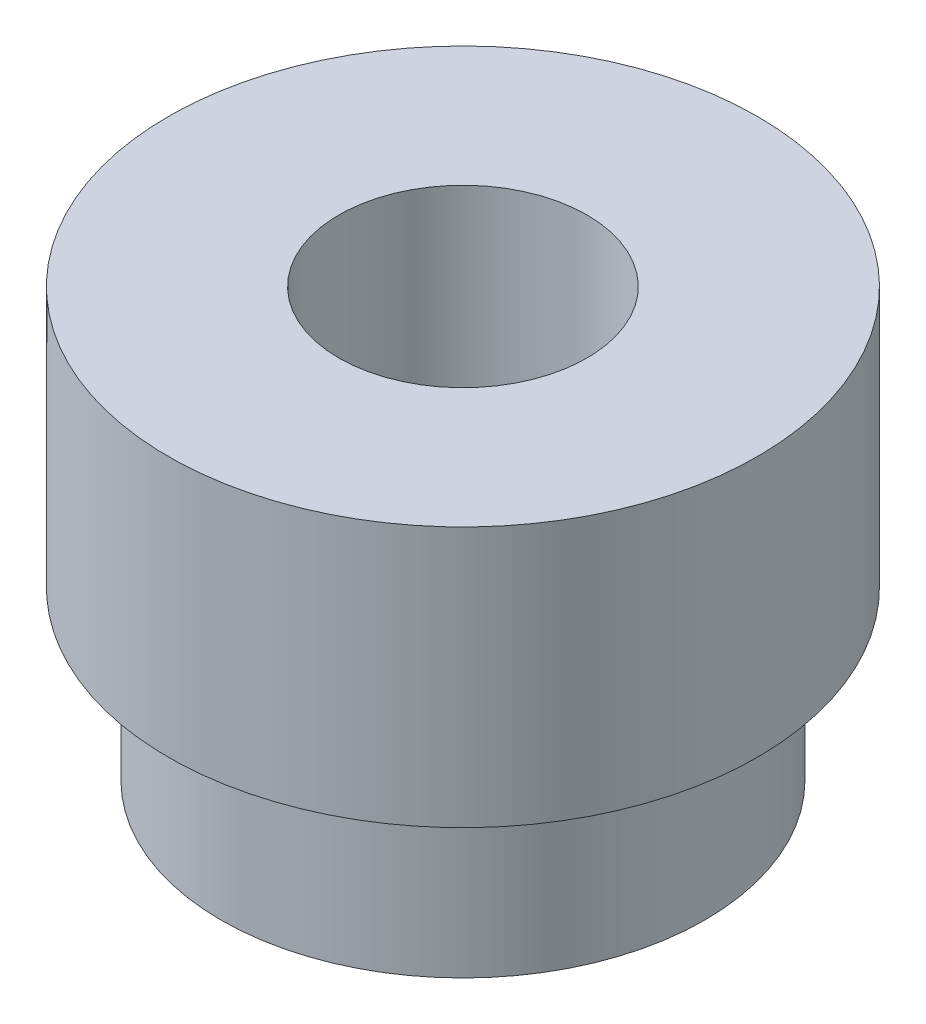
ISO-10303-21;
HEADER;
FILE_DESCRIPTION(('STEP AP214'),'2;1');
FILE_NAME('part.step','',(''),(''),'','','');
FILE_SCHEMA(('AUTOMOTIVE_DESIGN { 1 0 10303 214 1 1 1 1 }'));
ENDSEC;
DATA;
#1=APPLICATION_CONTEXT('core data for automotive mechanical design processes');
#2=APPLICATION_PROTOCOL_DEFINITION('international standard','automotive_design',2000,#1);
#3=PRODUCT_CONTEXT('',#1,'mechanical');
#4=PRODUCT('Part','Part','',(#3));
#5=PRODUCT_RELATED_PRODUCT_CATEGORY('part','',(#4));
#6=PRODUCT_DEFINITION_FORMATION('','',#4);
#7=PRODUCT_DEFINITION_CONTEXT('part definition',#1,'design');
#8=PRODUCT_DEFINITION('design','',#6,#7);
#9=PRODUCT_DEFINITION_SHAPE('','',#8);
#10=(LENGTH_UNIT() NAMED_UNIT(*) SI_UNIT(.MILLI.,.METRE.));
#11=(NAMED_UNIT(*) PLANE_ANGLE_UNIT() SI_UNIT($,.RADIAN.));
#12=(NAMED_UNIT(*) SI_UNIT($,.STERADIAN.) SOLID_ANGLE_UNIT());
#13=UNCERTAINTY_MEASURE_WITH_UNIT(LENGTH_MEASURE(1.E-05),#10,'distance_accuracy_value','');
#14=(GEOMETRIC_REPRESENTATION_CONTEXT(3) GLOBAL_UNCERTAINTY_ASSIGNED_CONTEXT((#13)) GLOBAL_UNIT_ASSIGNED_CONTEXT((#10,
#11,#12)) REPRESENTATION_CONTEXT('',''));
#15=CARTESIAN_POINT('',(0.,0.,0.));
#16=DIRECTION('',(0.,0.,1.));
#17=DIRECTION('',(1.,0.,0.));
#18=AXIS2_PLACEMENT_3D('',#15,#16,#17);
#19=CARTESIAN_POINT('',(0.,0.,0.));
#20=DIRECTION('',(0.,-1.,0.));
#21=DIRECTION('',(0.,0.,-1.));
#22=AXIS2_PLACEMENT_3D('',#19,#20,#21);
#23=CYLINDRICAL_SURFACE('',#22,1.);
#24=CARTESIAN_POINT('',(0.,3.45,0.));
#25=DIRECTION('',(0.,-1.,0.));
#26=DIRECTION('',(0.,0.,-1.));
#27=AXIS2_PLACEMENT_3D('',#24,#25,#26);
#28=CIRCLE('',#27,1.);
#29=CARTESIAN_POINT('',(0.,3.45,-1.));
#30=VERTEX_POINT('',#29);
#31=EDGE_CURVE('E10',#30,#30,#28,.T.);
#32=ORIENTED_EDGE('',*,*,#31,.F.);
#33=EDGE_LOOP('',(#32));
#34=FACE_BOUND('',#33,.T.);
#35=CARTESIAN_POINT('',(0.,0.,0.));
#36=DIRECTION('',(0.,-1.,0.));
#37=DIRECTION('',(0.,0.,-1.));
#38=AXIS2_PLACEMENT_3D('',#35,#36,#37);
#39=CIRCLE('',#38,1.);
#40=CARTESIAN_POINT('',(0.,0.,-1.));
#41=VERTEX_POINT('',#40);
#42=EDGE_CURVE('E63',#41,#41,#39,.T.);
#43=ORIENTED_EDGE('',*,*,#42,.T.);
#44=EDGE_LOOP('',(#43));
#45=FACE_BOUND('',#44,.T.);
#46=ADVANCED_FACE('F36',(#34,#45),#23,.F.);
#47=CARTESIAN_POINT('',(-1.,3.45,0.));
#48=DIRECTION('',(0.,-1.,0.));
#49=DIRECTION('',(0.,0.,-1.));
#50=AXIS2_PLACEMENT_3D('',#47,#48,#49);
#51=PLANE('',#50);
#52=CARTESIAN_POINT('',(0.,3.45,0.));
#53=DIRECTION('',(0.,-1.,0.));
#54=DIRECTION('',(0.,0.,-1.));
#55=AXIS2_PLACEMENT_3D('',#52,#53,#54);
#56=CIRCLE('',#55,2.375);
#57=CARTESIAN_POINT('',(0.,3.45,-2.375));
#58=VERTEX_POINT('',#57);
#59=EDGE_CURVE('E43',#58,#58,#56,.T.);
#60=ORIENTED_EDGE('',*,*,#59,.F.);
#61=EDGE_LOOP('',(#60));
#62=FACE_BOUND('',#61,.T.);
#63=ORIENTED_EDGE('',*,*,#31,.T.);
#64=EDGE_LOOP('',(#63));
#65=FACE_BOUND('',#64,.T.);
#66=ADVANCED_FACE('F89',(#62,#65),#51,.F.);
#67=CARTESIAN_POINT('',(0.,0.,0.));
#68=DIRECTION('',(0.,-1.,0.));
#69=DIRECTION('',(0.,0.,-1.));
#70=AXIS2_PLACEMENT_3D('',#67,#68,#69);
#71=CYLINDRICAL_SURFACE('',#70,2.375);
#72=CARTESIAN_POINT('',(0.,1.35,0.));
#73=DIRECTION('',(0.,-1.,0.));
#74=DIRECTION('',(0.,0.,-1.));
#75=AXIS2_PLACEMENT_3D('',#72,#73,#74);
#76=CIRCLE('',#75,2.375);
#77=CARTESIAN_POINT('',(0.,1.35,-2.375));
#78=VERTEX_POINT('',#77);
#79=EDGE_CURVE('E49',#78,#78,#76,.T.);
#80=ORIENTED_EDGE('',*,*,#79,.F.);
#81=EDGE_LOOP('',(#80));
#82=FACE_BOUND('',#81,.T.);
#83=ORIENTED_EDGE('',*,*,#59,.T.);
#84=EDGE_LOOP('',(#83));
#85=FACE_BOUND('',#84,.T.);
#86=ADVANCED_FACE('F84',(#82,#85),#71,.T.);
#87=CARTESIAN_POINT('',(-2.375,1.35,0.));
#88=DIRECTION('',(0.,1.,0.));
#89=DIRECTION('',(0.,0.,1.));
#90=AXIS2_PLACEMENT_3D('',#87,#88,#89);
#91=PLANE('',#90);
#92=CARTESIAN_POINT('',(0.,1.35,0.));
#93=DIRECTION('',(0.,-1.,0.));
#94=DIRECTION('',(0.,0.,-1.));
#95=AXIS2_PLACEMENT_3D('',#92,#93,#94);
#96=CIRCLE('',#95,1.95);
#97=CARTESIAN_POINT('',(0.,1.35,-1.95));
#98=VERTEX_POINT('',#97);
#99=EDGE_CURVE('E53',#98,#98,#96,.T.);
#100=ORIENTED_EDGE('',*,*,#99,.F.);
#101=EDGE_LOOP('',(#100));
#102=FACE_BOUND('',#101,.T.);
#103=ORIENTED_EDGE('',*,*,#79,.T.);
#104=EDGE_LOOP('',(#103));
#105=FACE_BOUND('',#104,.T.);
#106=ADVANCED_FACE('F78',(#102,#105),#91,.F.);
#107=CARTESIAN_POINT('',(0.,0.,0.));
#108=DIRECTION('',(0.,-1.,0.));
#109=DIRECTION('',(0.,0.,-1.));
#110=AXIS2_PLACEMENT_3D('',#107,#108,#109);
#111=CYLINDRICAL_SURFACE('',#110,1.95);
#112=CARTESIAN_POINT('',(0.,0.,0.));
#113=DIRECTION('',(0.,-1.,0.));
#114=DIRECTION('',(0.,0.,-1.));
#115=AXIS2_PLACEMENT_3D('',#112,#113,#114);
#116=CIRCLE('',#115,1.95);
#117=CARTESIAN_POINT('',(0.,0.,-1.95));
#118=VERTEX_POINT('',#117);
#119=EDGE_CURVE('E59',#118,#118,#116,.T.);
#120=ORIENTED_EDGE('',*,*,#119,.F.);
#121=EDGE_LOOP('',(#120));
#122=FACE_BOUND('',#121,.T.);
#123=ORIENTED_EDGE('',*,*,#99,.T.);
#124=EDGE_LOOP('',(#123));
#125=FACE_BOUND('',#124,.T.);
#126=ADVANCED_FACE('F72',(#122,#125),#111,.T.);
#127=CARTESIAN_POINT('',(-1.,0.,0.));
#128=DIRECTION('',(0.,1.,0.));
#129=DIRECTION('',(0.,0.,1.));
#130=AXIS2_PLACEMENT_3D('',#127,#128,#129);
#131=PLANE('',#130);
#132=ORIENTED_EDGE('',*,*,#42,.F.);
#133=EDGE_LOOP('',(#132));
#134=FACE_BOUND('',#133,.T.);
#135=ORIENTED_EDGE('',*,*,#119,.T.);
#136=EDGE_LOOP('',(#135));
#137=FACE_BOUND('',#136,.T.);
#138=ADVANCED_FACE('F69',(#134,#137),#131,.F.);
#139=CLOSED_SHELL('',(#46,#66,#86,#106,#126,#138));
#140=MANIFOLD_SOLID_BREP('B2',#139);
#141=ADVANCED_BREP_SHAPE_REPRESENTATION('',(#18,#140),#14);
#142=SHAPE_DEFINITION_REPRESENTATION(#9,#141);
ENDSEC;
END-ISO-10303-21;
